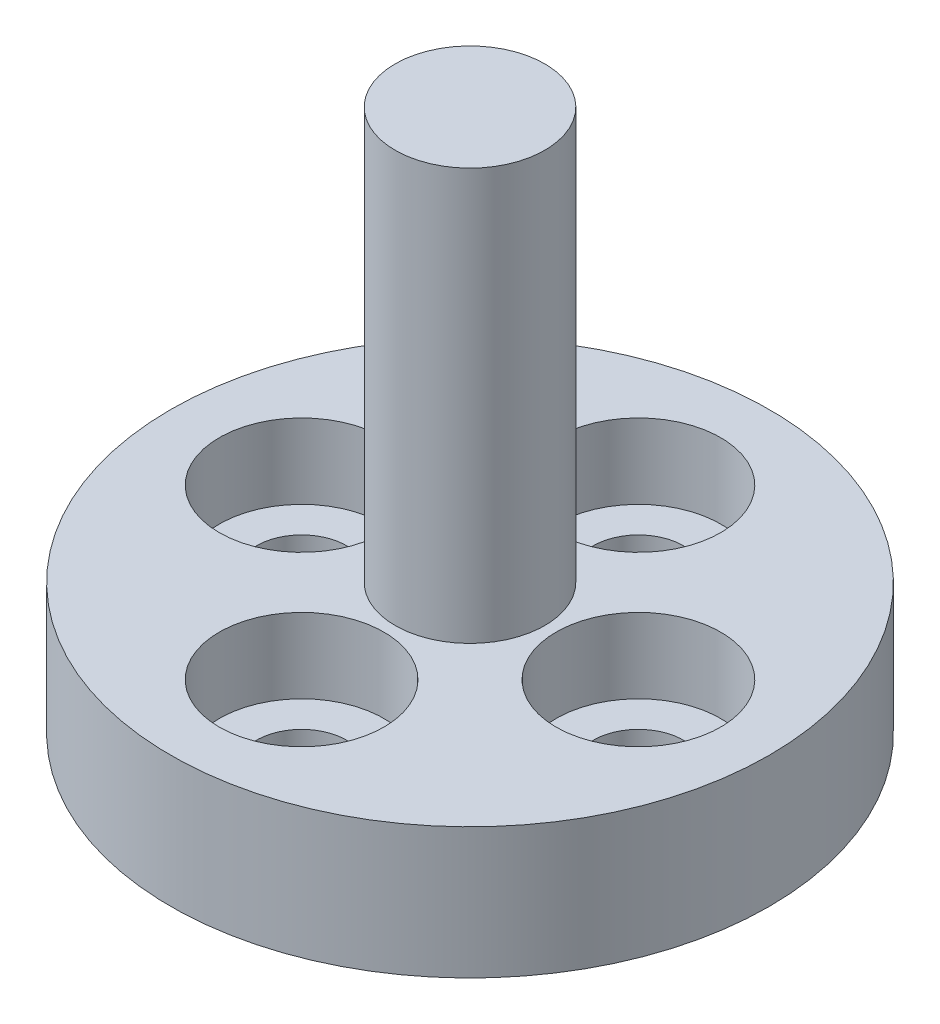
ISO-10303-21;
HEADER;
FILE_DESCRIPTION(('STEP AP214'),'2;1');
FILE_NAME('part.step','',(''),(''),'','','');
FILE_SCHEMA(('AUTOMOTIVE_DESIGN { 1 0 10303 214 1 1 1 1 }'));
ENDSEC;
DATA;
#1=APPLICATION_CONTEXT('core data for automotive mechanical design processes');
#2=APPLICATION_PROTOCOL_DEFINITION('international standard','automotive_design',2000,#1);
#3=PRODUCT_CONTEXT('',#1,'mechanical');
#4=PRODUCT('Part','Part','',(#3));
#5=PRODUCT_RELATED_PRODUCT_CATEGORY('part','',(#4));
#6=PRODUCT_DEFINITION_FORMATION('','',#4);
#7=PRODUCT_DEFINITION_CONTEXT('part definition',#1,'design');
#8=PRODUCT_DEFINITION('design','',#6,#7);
#9=PRODUCT_DEFINITION_SHAPE('','',#8);
#10=(LENGTH_UNIT() NAMED_UNIT(*) SI_UNIT(.MILLI.,.METRE.));
#11=(NAMED_UNIT(*) PLANE_ANGLE_UNIT() SI_UNIT($,.RADIAN.));
#12=(NAMED_UNIT(*) SI_UNIT($,.STERADIAN.) SOLID_ANGLE_UNIT());
#13=UNCERTAINTY_MEASURE_WITH_UNIT(LENGTH_MEASURE(1.E-05),#10,'distance_accuracy_value','');
#14=(GEOMETRIC_REPRESENTATION_CONTEXT(3) GLOBAL_UNCERTAINTY_ASSIGNED_CONTEXT((#13)) GLOBAL_UNIT_ASSIGNED_CONTEXT((#10,
#11,#12)) REPRESENTATION_CONTEXT('',''));
#15=CARTESIAN_POINT('',(0.,0.,0.));
#16=DIRECTION('',(0.,0.,1.));
#17=DIRECTION('',(1.,0.,0.));
#18=AXIS2_PLACEMENT_3D('',#15,#16,#17);
#19=CARTESIAN_POINT('',(0.,0.,0.));
#20=DIRECTION('',(0.,1.,0.));
#21=DIRECTION('',(-1.,0.,0.));
#22=AXIS2_PLACEMENT_3D('',#19,#20,#21);
#23=PLANE('',#22);
#24=CARTESIAN_POINT('',(-4.5,0.,0.));
#25=DIRECTION('',(0.,1.,0.));
#26=DIRECTION('',(0.,0.,1.));
#27=AXIS2_PLACEMENT_3D('',#24,#25,#26);
#28=CIRCLE('',#27,1.2);
#29=CARTESIAN_POINT('',(-4.5,0.,1.2));
#30=VERTEX_POINT('',#29);
#31=EDGE_CURVE('E101',#30,#30,#28,.T.);
#32=ORIENTED_EDGE('',*,*,#31,.T.);
#33=EDGE_LOOP('',(#32));
#34=FACE_BOUND('',#33,.T.);
#35=CARTESIAN_POINT('',(0.,0.,-4.5));
#36=DIRECTION('',(0.,1.,0.));
#37=DIRECTION('',(0.,0.,1.));
#38=AXIS2_PLACEMENT_3D('',#35,#36,#37);
#39=CIRCLE('',#38,1.2);
#40=CARTESIAN_POINT('',(0.,0.,-3.3));
#41=VERTEX_POINT('',#40);
#42=EDGE_CURVE('E89',#41,#41,#39,.T.);
#43=ORIENTED_EDGE('',*,*,#42,.T.);
#44=EDGE_LOOP('',(#43));
#45=FACE_BOUND('',#44,.T.);
#46=CARTESIAN_POINT('',(4.5,0.,0.));
#47=DIRECTION('',(0.,1.,0.));
#48=DIRECTION('',(0.,0.,1.));
#49=AXIS2_PLACEMENT_3D('',#46,#47,#48);
#50=CIRCLE('',#49,1.2);
#51=CARTESIAN_POINT('',(4.5,0.,1.2));
#52=VERTEX_POINT('',#51);
#53=EDGE_CURVE('E77',#52,#52,#50,.T.);
#54=ORIENTED_EDGE('',*,*,#53,.T.);
#55=EDGE_LOOP('',(#54));
#56=FACE_BOUND('',#55,.T.);
#57=CARTESIAN_POINT('',(0.,0.,4.5));
#58=DIRECTION('',(0.,1.,0.));
#59=DIRECTION('',(0.,0.,1.));
#60=AXIS2_PLACEMENT_3D('',#57,#58,#59);
#61=CIRCLE('',#60,1.2);
#62=CARTESIAN_POINT('',(0.,0.,5.7));
#63=VERTEX_POINT('',#62);
#64=EDGE_CURVE('E65',#63,#63,#61,.T.);
#65=ORIENTED_EDGE('',*,*,#64,.T.);
#66=EDGE_LOOP('',(#65));
#67=FACE_BOUND('',#66,.T.);
#68=CARTESIAN_POINT('',(0.,0.,0.));
#69=DIRECTION('',(0.,1.,0.));
#70=DIRECTION('',(-1.,0.,0.));
#71=AXIS2_PLACEMENT_3D('',#68,#69,#70);
#72=CIRCLE('',#71,8.);
#73=CARTESIAN_POINT('',(-8.,0.,0.));
#74=VERTEX_POINT('',#73);
#75=EDGE_CURVE('E12',#74,#74,#72,.T.);
#76=ORIENTED_EDGE('',*,*,#75,.F.);
#77=EDGE_LOOP('',(#76));
#78=FACE_BOUND('',#77,.T.);
#79=ADVANCED_FACE('F46',(#34,#45,#56,#67,#78),#23,.F.);
#80=CARTESIAN_POINT('',(0.,14.5,0.));
#81=DIRECTION('',(0.,1.,0.));
#82=DIRECTION('',(-1.,0.,0.));
#83=AXIS2_PLACEMENT_3D('',#80,#81,#82);
#84=CYLINDRICAL_SURFACE('',#83,8.);
#85=CARTESIAN_POINT('',(0.,3.5,0.));
#86=DIRECTION('',(0.,1.,0.));
#87=DIRECTION('',(-1.,0.,0.));
#88=AXIS2_PLACEMENT_3D('',#85,#86,#87);
#89=CIRCLE('',#88,8.);
#90=CARTESIAN_POINT('',(-8.,3.5,0.));
#91=VERTEX_POINT('',#90);
#92=EDGE_CURVE('E52',#91,#91,#89,.T.);
#93=ORIENTED_EDGE('',*,*,#92,.F.);
#94=EDGE_LOOP('',(#93));
#95=FACE_BOUND('',#94,.T.);
#96=ORIENTED_EDGE('',*,*,#75,.T.);
#97=EDGE_LOOP('',(#96));
#98=FACE_BOUND('',#97,.T.);
#99=ADVANCED_FACE('F120',(#95,#98),#84,.T.);
#100=CARTESIAN_POINT('',(8.,3.5,0.));
#101=DIRECTION('',(0.,-1.,0.));
#102=DIRECTION('',(1.,0.,0.));
#103=AXIS2_PLACEMENT_3D('',#100,#101,#102);
#104=PLANE('',#103);
#105=CARTESIAN_POINT('',(-4.5,3.5,0.));
#106=DIRECTION('',(0.,1.,0.));
#107=DIRECTION('',(0.,0.,1.));
#108=AXIS2_PLACEMENT_3D('',#105,#106,#107);
#109=CIRCLE('',#108,2.2);
#110=CARTESIAN_POINT('',(-4.5,3.5,2.2));
#111=VERTEX_POINT('',#110);
#112=EDGE_CURVE('E110',#111,#111,#109,.T.);
#113=ORIENTED_EDGE('',*,*,#112,.F.);
#114=EDGE_LOOP('',(#113));
#115=FACE_BOUND('',#114,.T.);
#116=CARTESIAN_POINT('',(0.,3.5,-4.5));
#117=DIRECTION('',(0.,1.,0.));
#118=DIRECTION('',(0.,0.,1.));
#119=AXIS2_PLACEMENT_3D('',#116,#117,#118);
#120=CIRCLE('',#119,2.2);
#121=CARTESIAN_POINT('',(0.,3.5,-2.3));
#122=VERTEX_POINT('',#121);
#123=EDGE_CURVE('E98',#122,#122,#120,.T.);
#124=ORIENTED_EDGE('',*,*,#123,.F.);
#125=EDGE_LOOP('',(#124));
#126=FACE_BOUND('',#125,.T.);
#127=CARTESIAN_POINT('',(4.5,3.5,0.));
#128=DIRECTION('',(0.,1.,0.));
#129=DIRECTION('',(0.,0.,1.));
#130=AXIS2_PLACEMENT_3D('',#127,#128,#129);
#131=CIRCLE('',#130,2.2);
#132=CARTESIAN_POINT('',(4.5,3.5,2.2));
#133=VERTEX_POINT('',#132);
#134=EDGE_CURVE('E86',#133,#133,#131,.T.);
#135=ORIENTED_EDGE('',*,*,#134,.F.);
#136=EDGE_LOOP('',(#135));
#137=FACE_BOUND('',#136,.T.);
#138=CARTESIAN_POINT('',(0.,3.5,4.5));
#139=DIRECTION('',(0.,1.,0.));
#140=DIRECTION('',(0.,0.,1.));
#141=AXIS2_PLACEMENT_3D('',#138,#139,#140);
#142=CIRCLE('',#141,2.2);
#143=CARTESIAN_POINT('',(0.,3.5,6.7));
#144=VERTEX_POINT('',#143);
#145=EDGE_CURVE('E74',#144,#144,#142,.T.);
#146=ORIENTED_EDGE('',*,*,#145,.F.);
#147=EDGE_LOOP('',(#146));
#148=FACE_BOUND('',#147,.T.);
#149=CARTESIAN_POINT('',(0.,3.5,0.));
#150=DIRECTION('',(0.,1.,0.));
#151=DIRECTION('',(-1.,0.,0.));
#152=AXIS2_PLACEMENT_3D('',#149,#150,#151);
#153=CIRCLE('',#152,2.);
#154=CARTESIAN_POINT('',(-2.,3.5,0.));
#155=VERTEX_POINT('',#154);
#156=EDGE_CURVE('E56',#155,#155,#153,.T.);
#157=ORIENTED_EDGE('',*,*,#156,.F.);
#158=EDGE_LOOP('',(#157));
#159=FACE_BOUND('',#158,.T.);
#160=ORIENTED_EDGE('',*,*,#92,.T.);
#161=EDGE_LOOP('',(#160));
#162=FACE_BOUND('',#161,.T.);
#163=ADVANCED_FACE('F116',(#115,#126,#137,#148,#159,#162),#104,.F.);
#164=CARTESIAN_POINT('',(0.,14.5,0.));
#165=DIRECTION('',(0.,1.,0.));
#166=DIRECTION('',(-1.,0.,0.));
#167=AXIS2_PLACEMENT_3D('',#164,#165,#166);
#168=CYLINDRICAL_SURFACE('',#167,2.);
#169=CARTESIAN_POINT('',(0.,14.5,0.));
#170=DIRECTION('',(0.,1.,0.));
#171=DIRECTION('',(-1.,0.,0.));
#172=AXIS2_PLACEMENT_3D('',#169,#170,#171);
#173=CIRCLE('',#172,2.);
#174=CARTESIAN_POINT('',(-2.,14.5,0.));
#175=VERTEX_POINT('',#174);
#176=EDGE_CURVE('E60',#175,#175,#173,.T.);
#177=ORIENTED_EDGE('',*,*,#176,.F.);
#178=EDGE_LOOP('',(#177));
#179=FACE_BOUND('',#178,.T.);
#180=ORIENTED_EDGE('',*,*,#156,.T.);
#181=EDGE_LOOP('',(#180));
#182=FACE_BOUND('',#181,.T.);
#183=ADVANCED_FACE('F119',(#179,#182),#168,.T.);
#184=CARTESIAN_POINT('',(2.,14.5,0.));
#185=DIRECTION('',(0.,-1.,0.));
#186=DIRECTION('',(1.,0.,0.));
#187=AXIS2_PLACEMENT_3D('',#184,#185,#186);
#188=PLANE('',#187);
#189=ORIENTED_EDGE('',*,*,#176,.T.);
#190=EDGE_LOOP('',(#189));
#191=FACE_BOUND('',#190,.T.);
#192=ADVANCED_FACE('F131',(#191),#188,.F.);
#193=CARTESIAN_POINT('',(0.,3.5,4.5));
#194=DIRECTION('',(0.,1.,0.));
#195=DIRECTION('',(0.,0.,1.));
#196=AXIS2_PLACEMENT_3D('',#193,#194,#195);
#197=CYLINDRICAL_SURFACE('',#196,1.2);
#198=ORIENTED_EDGE('',*,*,#64,.F.);
#199=EDGE_LOOP('',(#198));
#200=FACE_BOUND('',#199,.T.);
#201=CARTESIAN_POINT('',(0.,1.5,4.5));
#202=DIRECTION('',(0.,1.,0.));
#203=DIRECTION('',(0.,0.,1.));
#204=AXIS2_PLACEMENT_3D('',#201,#202,#203);
#205=CIRCLE('',#204,1.2);
#206=CARTESIAN_POINT('',(0.,1.5,5.7));
#207=VERTEX_POINT('',#206);
#208=EDGE_CURVE('E68',#207,#207,#205,.T.);
#209=ORIENTED_EDGE('',*,*,#208,.T.);
#210=EDGE_LOOP('',(#209));
#211=FACE_BOUND('',#210,.T.);
#212=ADVANCED_FACE('F137',(#200,#211),#197,.F.);
#213=CARTESIAN_POINT('',(1.2,1.5,4.5));
#214=DIRECTION('',(0.,-1.,0.));
#215=DIRECTION('',(0.,0.,-1.));
#216=AXIS2_PLACEMENT_3D('',#213,#214,#215);
#217=PLANE('',#216);
#218=ORIENTED_EDGE('',*,*,#208,.F.);
#219=EDGE_LOOP('',(#218));
#220=FACE_BOUND('',#219,.T.);
#221=CARTESIAN_POINT('',(0.,1.5,4.5));
#222=DIRECTION('',(0.,1.,0.));
#223=DIRECTION('',(0.,0.,1.));
#224=AXIS2_PLACEMENT_3D('',#221,#222,#223);
#225=CIRCLE('',#224,2.2);
#226=CARTESIAN_POINT('',(0.,1.5,6.7));
#227=VERTEX_POINT('',#226);
#228=EDGE_CURVE('E71',#227,#227,#225,.T.);
#229=ORIENTED_EDGE('',*,*,#228,.T.);
#230=EDGE_LOOP('',(#229));
#231=FACE_BOUND('',#230,.T.);
#232=ADVANCED_FACE('F158',(#220,#231),#217,.F.);
#233=CARTESIAN_POINT('',(0.,3.5,4.5));
#234=DIRECTION('',(0.,1.,0.));
#235=DIRECTION('',(0.,0.,1.));
#236=AXIS2_PLACEMENT_3D('',#233,#234,#235);
#237=CYLINDRICAL_SURFACE('',#236,2.2);
#238=ORIENTED_EDGE('',*,*,#228,.F.);
#239=EDGE_LOOP('',(#238));
#240=FACE_BOUND('',#239,.T.);
#241=ORIENTED_EDGE('',*,*,#145,.T.);
#242=EDGE_LOOP('',(#241));
#243=FACE_BOUND('',#242,.T.);
#244=ADVANCED_FACE('F164',(#240,#243),#237,.F.);
#245=CARTESIAN_POINT('',(4.5,3.5,0.));
#246=DIRECTION('',(0.,1.,0.));
#247=DIRECTION('',(0.,0.,1.));
#248=AXIS2_PLACEMENT_3D('',#245,#246,#247);
#249=CYLINDRICAL_SURFACE('',#248,1.2);
#250=ORIENTED_EDGE('',*,*,#53,.F.);
#251=EDGE_LOOP('',(#250));
#252=FACE_BOUND('',#251,.T.);
#253=CARTESIAN_POINT('',(4.5,1.5,0.));
#254=DIRECTION('',(0.,1.,0.));
#255=DIRECTION('',(0.,0.,1.));
#256=AXIS2_PLACEMENT_3D('',#253,#254,#255);
#257=CIRCLE('',#256,1.2);
#258=CARTESIAN_POINT('',(4.5,1.5,1.2));
#259=VERTEX_POINT('',#258);
#260=EDGE_CURVE('E80',#259,#259,#257,.T.);
#261=ORIENTED_EDGE('',*,*,#260,.T.);
#262=EDGE_LOOP('',(#261));
#263=FACE_BOUND('',#262,.T.);
#264=ADVANCED_FACE('F170',(#252,#263),#249,.F.);
#265=CARTESIAN_POINT('',(5.7,1.5,0.));
#266=DIRECTION('',(0.,-1.,0.));
#267=DIRECTION('',(0.,0.,-1.));
#268=AXIS2_PLACEMENT_3D('',#265,#266,#267);
#269=PLANE('',#268);
#270=ORIENTED_EDGE('',*,*,#260,.F.);
#271=EDGE_LOOP('',(#270));
#272=FACE_BOUND('',#271,.T.);
#273=CARTESIAN_POINT('',(4.5,1.5,0.));
#274=DIRECTION('',(0.,1.,0.));
#275=DIRECTION('',(0.,0.,1.));
#276=AXIS2_PLACEMENT_3D('',#273,#274,#275);
#277=CIRCLE('',#276,2.2);
#278=CARTESIAN_POINT('',(4.5,1.5,2.2));
#279=VERTEX_POINT('',#278);
#280=EDGE_CURVE('E83',#279,#279,#277,.T.);
#281=ORIENTED_EDGE('',*,*,#280,.T.);
#282=EDGE_LOOP('',(#281));
#283=FACE_BOUND('',#282,.T.);
#284=ADVANCED_FACE('F175',(#272,#283),#269,.F.);
#285=CARTESIAN_POINT('',(4.5,3.5,0.));
#286=DIRECTION('',(0.,1.,0.));
#287=DIRECTION('',(0.,0.,1.));
#288=AXIS2_PLACEMENT_3D('',#285,#286,#287);
#289=CYLINDRICAL_SURFACE('',#288,2.2);
#290=ORIENTED_EDGE('',*,*,#280,.F.);
#291=EDGE_LOOP('',(#290));
#292=FACE_BOUND('',#291,.T.);
#293=ORIENTED_EDGE('',*,*,#134,.T.);
#294=EDGE_LOOP('',(#293));
#295=FACE_BOUND('',#294,.T.);
#296=ADVANCED_FACE('F181',(#292,#295),#289,.F.);
#297=CARTESIAN_POINT('',(0.,3.5,-4.5));
#298=DIRECTION('',(0.,1.,0.));
#299=DIRECTION('',(0.,0.,1.));
#300=AXIS2_PLACEMENT_3D('',#297,#298,#299);
#301=CYLINDRICAL_SURFACE('',#300,1.2);
#302=ORIENTED_EDGE('',*,*,#42,.F.);
#303=EDGE_LOOP('',(#302));
#304=FACE_BOUND('',#303,.T.);
#305=CARTESIAN_POINT('',(0.,1.5,-4.5));
#306=DIRECTION('',(0.,1.,0.));
#307=DIRECTION('',(0.,0.,1.));
#308=AXIS2_PLACEMENT_3D('',#305,#306,#307);
#309=CIRCLE('',#308,1.2);
#310=CARTESIAN_POINT('',(0.,1.5,-3.3));
#311=VERTEX_POINT('',#310);
#312=EDGE_CURVE('E92',#311,#311,#309,.T.);
#313=ORIENTED_EDGE('',*,*,#312,.T.);
#314=EDGE_LOOP('',(#313));
#315=FACE_BOUND('',#314,.T.);
#316=ADVANCED_FACE('F185',(#304,#315),#301,.F.);
#317=CARTESIAN_POINT('',(1.2,1.5,-4.5));
#318=DIRECTION('',(0.,-1.,0.));
#319=DIRECTION('',(0.,0.,-1.));
#320=AXIS2_PLACEMENT_3D('',#317,#318,#319);
#321=PLANE('',#320);
#322=ORIENTED_EDGE('',*,*,#312,.F.);
#323=EDGE_LOOP('',(#322));
#324=FACE_BOUND('',#323,.T.);
#325=CARTESIAN_POINT('',(0.,1.5,-4.5));
#326=DIRECTION('',(0.,1.,0.));
#327=DIRECTION('',(0.,0.,1.));
#328=AXIS2_PLACEMENT_3D('',#325,#326,#327);
#329=CIRCLE('',#328,2.2);
#330=CARTESIAN_POINT('',(0.,1.5,-2.3));
#331=VERTEX_POINT('',#330);
#332=EDGE_CURVE('E95',#331,#331,#329,.T.);
#333=ORIENTED_EDGE('',*,*,#332,.T.);
#334=EDGE_LOOP('',(#333));
#335=FACE_BOUND('',#334,.T.);
#336=ADVANCED_FACE('F189',(#324,#335),#321,.F.);
#337=CARTESIAN_POINT('',(0.,3.5,-4.5));
#338=DIRECTION('',(0.,1.,0.));
#339=DIRECTION('',(0.,0.,1.));
#340=AXIS2_PLACEMENT_3D('',#337,#338,#339);
#341=CYLINDRICAL_SURFACE('',#340,2.2);
#342=ORIENTED_EDGE('',*,*,#332,.F.);
#343=EDGE_LOOP('',(#342));
#344=FACE_BOUND('',#343,.T.);
#345=ORIENTED_EDGE('',*,*,#123,.T.);
#346=EDGE_LOOP('',(#345));
#347=FACE_BOUND('',#346,.T.);
#348=ADVANCED_FACE('F193',(#344,#347),#341,.F.);
#349=CARTESIAN_POINT('',(-4.5,3.5,0.));
#350=DIRECTION('',(0.,1.,0.));
#351=DIRECTION('',(0.,0.,1.));
#352=AXIS2_PLACEMENT_3D('',#349,#350,#351);
#353=CYLINDRICAL_SURFACE('',#352,1.2);
#354=ORIENTED_EDGE('',*,*,#31,.F.);
#355=EDGE_LOOP('',(#354));
#356=FACE_BOUND('',#355,.T.);
#357=CARTESIAN_POINT('',(-4.5,1.5,0.));
#358=DIRECTION('',(0.,1.,0.));
#359=DIRECTION('',(0.,0.,1.));
#360=AXIS2_PLACEMENT_3D('',#357,#358,#359);
#361=CIRCLE('',#360,1.2);
#362=CARTESIAN_POINT('',(-4.5,1.5,1.2));
#363=VERTEX_POINT('',#362);
#364=EDGE_CURVE('E104',#363,#363,#361,.T.);
#365=ORIENTED_EDGE('',*,*,#364,.T.);
#366=EDGE_LOOP('',(#365));
#367=FACE_BOUND('',#366,.T.);
#368=ADVANCED_FACE('F197',(#356,#367),#353,.F.);
#369=CARTESIAN_POINT('',(-3.3,1.5,0.));
#370=DIRECTION('',(0.,-1.,0.));
#371=DIRECTION('',(0.,0.,-1.));
#372=AXIS2_PLACEMENT_3D('',#369,#370,#371);
#373=PLANE('',#372);
#374=ORIENTED_EDGE('',*,*,#364,.F.);
#375=EDGE_LOOP('',(#374));
#376=FACE_BOUND('',#375,.T.);
#377=CARTESIAN_POINT('',(-4.5,1.5,0.));
#378=DIRECTION('',(0.,1.,0.));
#379=DIRECTION('',(0.,0.,1.));
#380=AXIS2_PLACEMENT_3D('',#377,#378,#379);
#381=CIRCLE('',#380,2.2);
#382=CARTESIAN_POINT('',(-4.5,1.5,2.2));
#383=VERTEX_POINT('',#382);
#384=EDGE_CURVE('E107',#383,#383,#381,.T.);
#385=ORIENTED_EDGE('',*,*,#384,.T.);
#386=EDGE_LOOP('',(#385));
#387=FACE_BOUND('',#386,.T.);
#388=ADVANCED_FACE('F201',(#376,#387),#373,.F.);
#389=CARTESIAN_POINT('',(-4.5,3.5,0.));
#390=DIRECTION('',(0.,1.,0.));
#391=DIRECTION('',(0.,0.,1.));
#392=AXIS2_PLACEMENT_3D('',#389,#390,#391);
#393=CYLINDRICAL_SURFACE('',#392,2.2);
#394=ORIENTED_EDGE('',*,*,#384,.F.);
#395=EDGE_LOOP('',(#394));
#396=FACE_BOUND('',#395,.T.);
#397=ORIENTED_EDGE('',*,*,#112,.T.);
#398=EDGE_LOOP('',(#397));
#399=FACE_BOUND('',#398,.T.);
#400=ADVANCED_FACE('F114',(#396,#399),#393,.F.);
#401=CLOSED_SHELL('',(#79,#99,#163,#183,#192,#212,#232,#244,#264,#284,#296,#316,#336,#348,#368,
#388,#400));
#402=MANIFOLD_SOLID_BREP('B2',#401);
#403=ADVANCED_BREP_SHAPE_REPRESENTATION('',(#18,#402),#14);
#404=SHAPE_DEFINITION_REPRESENTATION(#9,#403);
ENDSEC;
END-ISO-10303-21;
